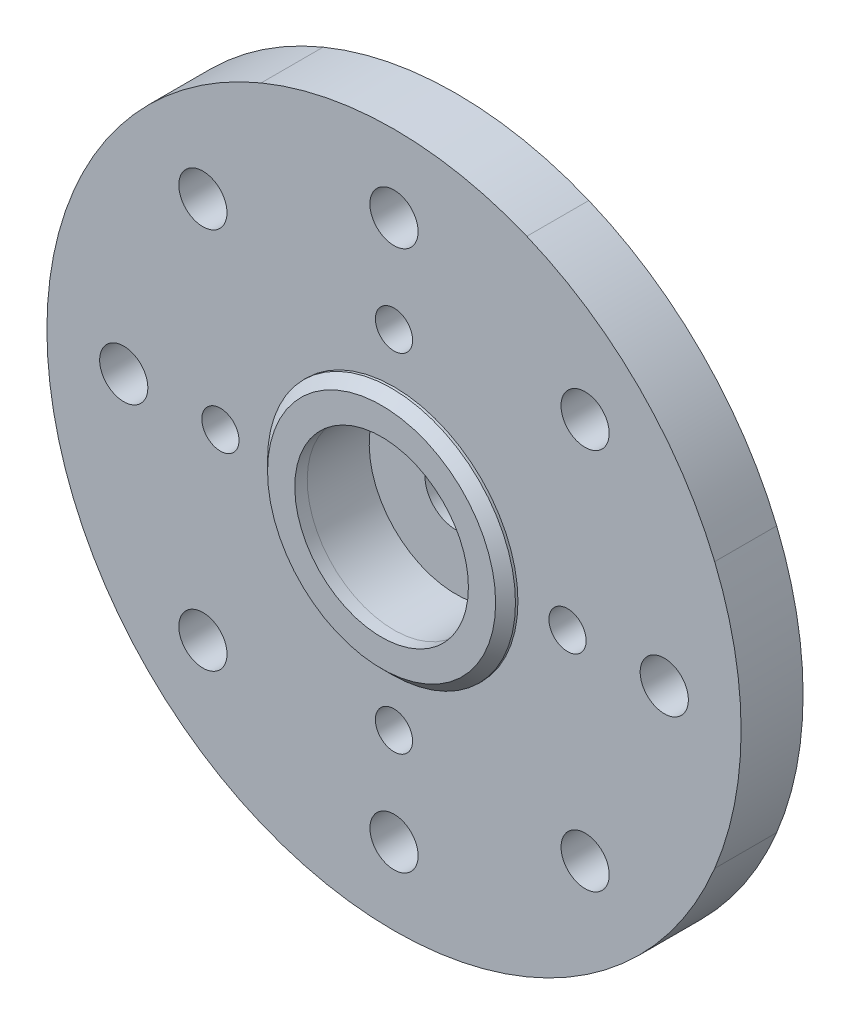
ISO-10303-21;
HEADER;
FILE_DESCRIPTION(('STEP AP214'),'2;1');
FILE_NAME('part.step','',(''),(''),'','','');
FILE_SCHEMA(('AUTOMOTIVE_DESIGN { 1 0 10303 214 1 1 1 1 }'));
ENDSEC;
DATA;
#1=APPLICATION_CONTEXT('core data for automotive mechanical design processes');
#2=APPLICATION_PROTOCOL_DEFINITION('international standard','automotive_design',2000,#1);
#3=PRODUCT_CONTEXT('',#1,'mechanical');
#4=PRODUCT('Part','Part','',(#3));
#5=PRODUCT_RELATED_PRODUCT_CATEGORY('part','',(#4));
#6=PRODUCT_DEFINITION_FORMATION('','',#4);
#7=PRODUCT_DEFINITION_CONTEXT('part definition',#1,'design');
#8=PRODUCT_DEFINITION('design','',#6,#7);
#9=PRODUCT_DEFINITION_SHAPE('','',#8);
#10=(LENGTH_UNIT() NAMED_UNIT(*) SI_UNIT(.MILLI.,.METRE.));
#11=(NAMED_UNIT(*) PLANE_ANGLE_UNIT() SI_UNIT($,.RADIAN.));
#12=(NAMED_UNIT(*) SI_UNIT($,.STERADIAN.) SOLID_ANGLE_UNIT());
#13=UNCERTAINTY_MEASURE_WITH_UNIT(LENGTH_MEASURE(1.E-05),#10,'distance_accuracy_value','');
#14=(GEOMETRIC_REPRESENTATION_CONTEXT(3) GLOBAL_UNCERTAINTY_ASSIGNED_CONTEXT((#13)) GLOBAL_UNIT_ASSIGNED_CONTEXT((#10,
#11,#12)) REPRESENTATION_CONTEXT('',''));
#15=CARTESIAN_POINT('',(0.,0.,0.));
#16=DIRECTION('',(0.,0.,1.));
#17=DIRECTION('',(1.,0.,0.));
#18=AXIS2_PLACEMENT_3D('',#15,#16,#17);
#19=CARTESIAN_POINT('',(0.,0.,0.));
#20=DIRECTION('',(0.,0.,1.));
#21=DIRECTION('',(1.,0.,0.));
#22=AXIS2_PLACEMENT_3D('',#19,#20,#21);
#23=PLANE('',#22);
#24=CARTESIAN_POINT('',(-10.899,-0.000999999999885828,0.));
#25=DIRECTION('',(0.,0.,1.));
#26=DIRECTION('',(1.,0.,0.));
#27=AXIS2_PLACEMENT_3D('',#24,#25,#26);
#28=CIRCLE('',#27,0.971780714285714);
#29=CARTESIAN_POINT('',(-9.92721928571429,-0.000999999999885828,0.));
#30=VERTEX_POINT('',#29);
#31=EDGE_CURVE('E197',#30,#30,#28,.T.);
#32=ORIENTED_EDGE('',*,*,#31,.T.);
#33=EDGE_LOOP('',(#32));
#34=FACE_BOUND('',#33,.T.);
#35=CARTESIAN_POINT('',(-7.70575680815225,-7.70817102171449,0.));
#36=DIRECTION('',(0.,0.,1.));
#37=DIRECTION('',(1.,0.,0.));
#38=AXIS2_PLACEMENT_3D('',#35,#36,#37);
#39=CIRCLE('',#38,0.971780714285715);
#40=CARTESIAN_POINT('',(-6.73397609386653,-7.70817102171449,0.));
#41=VERTEX_POINT('',#40);
#42=EDGE_CURVE('E194',#41,#41,#39,.T.);
#43=ORIENTED_EDGE('',*,*,#42,.T.);
#44=EDGE_LOOP('',(#43));
#45=FACE_BOUND('',#44,.T.);
#46=CARTESIAN_POINT('',(-7.70717102171446,7.70675680815227,0.));
#47=DIRECTION('',(0.,0.,1.));
#48=DIRECTION('',(1.,0.,0.));
#49=AXIS2_PLACEMENT_3D('',#46,#47,#48);
#50=CIRCLE('',#49,0.971780714285714);
#51=CARTESIAN_POINT('',(-6.73539030742875,7.70675680815227,0.));
#52=VERTEX_POINT('',#51);
#53=EDGE_CURVE('E191',#52,#52,#50,.T.);
#54=ORIENTED_EDGE('',*,*,#53,.T.);
#55=EDGE_LOOP('',(#54));
#56=FACE_BOUND('',#55,.T.);
#57=CARTESIAN_POINT('',(-6.99999999999981,-1.94734675410807E-13,0.));
#58=DIRECTION('',(0.,0.,1.));
#59=DIRECTION('',(1.,0.,0.));
#60=AXIS2_PLACEMENT_3D('',#57,#58,#59);
#61=CIRCLE('',#60,0.750000000000418);
#62=CARTESIAN_POINT('',(-6.24999999999939,-1.94734675410807E-13,0.));
#63=VERTEX_POINT('',#62);
#64=EDGE_CURVE('E188',#63,#63,#61,.T.);
#65=ORIENTED_EDGE('',*,*,#64,.T.);
#66=EDGE_LOOP('',(#65));
#67=FACE_BOUND('',#66,.T.);
#68=CARTESIAN_POINT('',(0.00099999999999999,-0.001,0.));
#69=DIRECTION('',(0.,0.,1.));
#70=DIRECTION('',(1.,0.,0.));
#71=AXIS2_PLACEMENT_3D('',#68,#69,#70);
#72=CIRCLE('',#71,14.);
#73=CARTESIAN_POINT('',(5.35821449768997,12.9334598969474,0.));
#74=VERTEX_POINT('',#73);
#75=CARTESIAN_POINT('',(-5.35621449771901,12.9334598969354,0.));
#76=VERTEX_POINT('',#75);
#77=EDGE_CURVE('E174',#74,#76,#72,.T.);
#78=ORIENTED_EDGE('',*,*,#77,.F.);
#79=CARTESIAN_POINT('',(0.000292893218813444,-0.000707106781186539,0.));
#80=DIRECTION('',(0.,0.,1.));
#81=DIRECTION('',(1.,0.,0.));
#82=AXIS2_PLACEMENT_3D('',#79,#80,#81);
#83=CIRCLE('',#82,14.);
#84=CARTESIAN_POINT('',(12.9344598969475,5.35721449768974,0.));
#85=VERTEX_POINT('',#84);
#86=EDGE_CURVE('E87',#85,#74,#83,.T.);
#87=ORIENTED_EDGE('',*,*,#86,.F.);
#88=CARTESIAN_POINT('',(0.,0.,0.));
#89=DIRECTION('',(0.,0.,1.));
#90=DIRECTION('',(1.,0.,0.));
#91=AXIS2_PLACEMENT_3D('',#88,#89,#90);
#92=CIRCLE('',#91,14.);
#93=CARTESIAN_POINT('',(12.9344598969353,-5.35721449771915,0.));
#94=VERTEX_POINT('',#93);
#95=EDGE_CURVE('E81',#94,#85,#92,.T.);
#96=ORIENTED_EDGE('',*,*,#95,.F.);
#97=CARTESIAN_POINT('',(0.000292893218813454,0.000707106781186549,0.));
#98=DIRECTION('',(0.,0.,1.));
#99=DIRECTION('',(1.,0.,0.));
#100=AXIS2_PLACEMENT_3D('',#97,#98,#99);
#101=CIRCLE('',#100,14.);
#102=CARTESIAN_POINT('',(5.35821449771911,-12.9334598969353,0.));
#103=VERTEX_POINT('',#102);
#104=EDGE_CURVE('E124',#103,#94,#101,.T.);
#105=ORIENTED_EDGE('',*,*,#104,.F.);
#106=CARTESIAN_POINT('',(0.001,0.001,0.));
#107=DIRECTION('',(0.,0.,1.));
#108=DIRECTION('',(1.,0.,0.));
#109=AXIS2_PLACEMENT_3D('',#106,#107,#108);
#110=CIRCLE('',#109,14.);
#111=CARTESIAN_POINT('',(-5.3562144977192,-12.9334598969353,0.));
#112=VERTEX_POINT('',#111);
#113=EDGE_CURVE('E183',#112,#103,#110,.T.);
#114=ORIENTED_EDGE('',*,*,#113,.F.);
#115=CARTESIAN_POINT('',(0.00170710678118655,0.000707106781186544,0.));
#116=DIRECTION('',(0.,0.,1.));
#117=DIRECTION('',(1.,0.,0.));
#118=AXIS2_PLACEMENT_3D('',#115,#116,#117);
#119=CIRCLE('',#118,14.);
#120=CARTESIAN_POINT('',(-12.9324598969353,-5.35721449771906,0.));
#121=VERTEX_POINT('',#120);
#122=EDGE_CURVE('E181',#121,#112,#119,.T.);
#123=ORIENTED_EDGE('',*,*,#122,.F.);
#124=CARTESIAN_POINT('',(0.002,0.,0.));
#125=DIRECTION('',(0.,0.,1.));
#126=DIRECTION('',(1.,0.,0.));
#127=AXIS2_PLACEMENT_3D('',#124,#125,#126);
#128=CIRCLE('',#127,14.);
#129=CARTESIAN_POINT('',(-12.9324598969353,5.35721449771924,0.));
#130=VERTEX_POINT('',#129);
#131=EDGE_CURVE('E179',#130,#121,#128,.T.);
#132=ORIENTED_EDGE('',*,*,#131,.F.);
#133=CARTESIAN_POINT('',(0.00170710678118654,-0.000707106781186554,0.));
#134=DIRECTION('',(0.,0.,1.));
#135=DIRECTION('',(1.,0.,0.));
#136=AXIS2_PLACEMENT_3D('',#133,#134,#135);
#137=CIRCLE('',#136,14.);
#138=EDGE_CURVE('E177',#76,#130,#137,.T.);
#139=ORIENTED_EDGE('',*,*,#138,.F.);
#140=EDGE_LOOP('',(#78,#87,#96,#105,#114,#123,#132,#139));
#141=FACE_BOUND('',#140,.T.);
#142=CARTESIAN_POINT('',(7.00000000000019,1.93877422651404E-13,0.));
#143=DIRECTION('',(0.,0.,1.));
#144=DIRECTION('',(1.,0.,0.));
#145=AXIS2_PLACEMENT_3D('',#142,#143,#144);
#146=CIRCLE('',#145,0.750000000000418);
#147=CARTESIAN_POINT('',(7.75000000000061,1.93877422651404E-13,0.));
#148=VERTEX_POINT('',#147);
#149=EDGE_CURVE('E171',#148,#148,#146,.T.);
#150=ORIENTED_EDGE('',*,*,#149,.T.);
#151=EDGE_LOOP('',(#150));
#152=FACE_BOUND('',#151,.T.);
#153=CARTESIAN_POINT('',(7.70917102171451,-7.70675680815222,0.));
#154=DIRECTION('',(0.,0.,1.));
#155=DIRECTION('',(1.,0.,0.));
#156=AXIS2_PLACEMENT_3D('',#153,#154,#155);
#157=CIRCLE('',#156,0.971780714285714);
#158=CARTESIAN_POINT('',(8.68095173600023,-7.70675680815222,0.));
#159=VERTEX_POINT('',#158);
#160=EDGE_CURVE('E168',#159,#159,#157,.T.);
#161=ORIENTED_EDGE('',*,*,#160,.T.);
#162=EDGE_LOOP('',(#161));
#163=FACE_BOUND('',#162,.T.);
#164=CARTESIAN_POINT('',(7.70775680815219,7.70817102171454,0.));
#165=DIRECTION('',(0.,0.,1.));
#166=DIRECTION('',(1.,0.,0.));
#167=AXIS2_PLACEMENT_3D('',#164,#165,#166);
#168=CIRCLE('',#167,0.971780714285715);
#169=CARTESIAN_POINT('',(8.67953752243791,7.70817102171454,0.));
#170=VERTEX_POINT('',#169);
#171=EDGE_CURVE('E165',#170,#170,#168,.T.);
#172=ORIENTED_EDGE('',*,*,#171,.T.);
#173=EDGE_LOOP('',(#172));
#174=FACE_BOUND('',#173,.T.);
#175=CARTESIAN_POINT('',(10.901,0.000999999999961943,0.));
#176=DIRECTION('',(0.,0.,1.));
#177=DIRECTION('',(1.,0.,0.));
#178=AXIS2_PLACEMENT_3D('',#175,#176,#177);
#179=CIRCLE('',#178,0.971780714285715);
#180=CARTESIAN_POINT('',(11.8727807142857,0.000999999999961943,0.));
#181=VERTEX_POINT('',#180);
#182=EDGE_CURVE('E162',#181,#181,#179,.T.);
#183=ORIENTED_EDGE('',*,*,#182,.T.);
#184=EDGE_LOOP('',(#183));
#185=FACE_BOUND('',#184,.T.);
#186=CARTESIAN_POINT('',(0.00199999999992389,-10.9,0.));
#187=DIRECTION('',(0.,0.,1.));
#188=DIRECTION('',(1.,0.,0.));
#189=AXIS2_PLACEMENT_3D('',#186,#187,#188);
#190=CIRCLE('',#189,0.971780714285714);
#191=CARTESIAN_POINT('',(0.973780714285638,-10.9,0.));
#192=VERTEX_POINT('',#191);
#193=EDGE_CURVE('E159',#192,#192,#190,.T.);
#194=ORIENTED_EDGE('',*,*,#193,.T.);
#195=EDGE_LOOP('',(#194));
#196=FACE_BOUND('',#195,.T.);
#197=CARTESIAN_POINT('',(3.88612098062211E-13,-7.,0.));
#198=DIRECTION('',(0.,0.,1.));
#199=DIRECTION('',(1.,0.,0.));
#200=AXIS2_PLACEMENT_3D('',#197,#198,#199);
#201=CIRCLE('',#200,0.750000000000418);
#202=CARTESIAN_POINT('',(0.750000000000807,-7.,0.));
#203=VERTEX_POINT('',#202);
#204=EDGE_CURVE('E156',#203,#203,#201,.T.);
#205=ORIENTED_EDGE('',*,*,#204,.T.);
#206=EDGE_LOOP('',(#205));
#207=FACE_BOUND('',#206,.T.);
#208=CARTESIAN_POINT('',(0.,7.,0.));
#209=DIRECTION('',(0.,0.,1.));
#210=DIRECTION('',(1.,0.,0.));
#211=AXIS2_PLACEMENT_3D('',#208,#209,#210);
#212=CIRCLE('',#211,0.750000000000418);
#213=CARTESIAN_POINT('',(0.750000000000419,7.,0.));
#214=VERTEX_POINT('',#213);
#215=EDGE_CURVE('E149',#214,#214,#212,.T.);
#216=ORIENTED_EDGE('',*,*,#215,.T.);
#217=EDGE_LOOP('',(#216));
#218=FACE_BOUND('',#217,.T.);
#219=CARTESIAN_POINT('',(0.,10.9,0.));
#220=DIRECTION('',(0.,0.,1.));
#221=DIRECTION('',(1.,0.,0.));
#222=AXIS2_PLACEMENT_3D('',#219,#220,#221);
#223=CIRCLE('',#222,0.971780714285715);
#224=CARTESIAN_POINT('',(0.971780714285715,10.9,0.));
#225=VERTEX_POINT('',#224);
#226=EDGE_CURVE('E146',#225,#225,#223,.T.);
#227=ORIENTED_EDGE('',*,*,#226,.T.);
#228=EDGE_LOOP('',(#227));
#229=FACE_BOUND('',#228,.T.);
#230=CARTESIAN_POINT('',(0.,0.,0.));
#231=DIRECTION('',(0.,0.,1.));
#232=DIRECTION('',(1.,0.,0.));
#233=AXIS2_PLACEMENT_3D('',#230,#231,#232);
#234=CIRCLE('',#233,5.);
#235=CARTESIAN_POINT('',(5.,0.,0.));
#236=VERTEX_POINT('',#235);
#237=EDGE_CURVE('E215',#236,#236,#234,.F.);
#238=ORIENTED_EDGE('',*,*,#237,.F.);
#239=EDGE_LOOP('',(#238));
#240=FACE_BOUND('',#239,.T.);
#241=ADVANCED_FACE('F35',(#34,#45,#56,#67,#141,#152,#163,#174,#185,#196,#207,#218,#229,#240),
#23,.F.);
#242=CARTESIAN_POINT('',(0.00099999999999999,-0.001,2.5));
#243=DIRECTION('',(0.,0.,-1.));
#244=DIRECTION('',(-1.,0.,0.));
#245=AXIS2_PLACEMENT_3D('',#242,#243,#244);
#246=CYLINDRICAL_SURFACE('',#245,14.);
#247=ORIENTED_EDGE('',*,*,#77,.T.);
#248=DIRECTION('',(0.,0.,-1.));
#249=VECTOR('',#248,1.);
#250=CARTESIAN_POINT('',(-5.35621449771901,12.9334598969354,2.5));
#251=LINE('',#250,#249);
#252=CARTESIAN_POINT('',(-5.35621449771901,12.9334598969354,2.5));
#253=VERTEX_POINT('',#252);
#254=EDGE_CURVE('E213',#253,#76,#251,.T.);
#255=ORIENTED_EDGE('',*,*,#254,.F.);
#256=CARTESIAN_POINT('',(0.00099999999999999,-0.001,2.5));
#257=DIRECTION('',(0.,0.,1.));
#258=DIRECTION('',(1.,0.,0.));
#259=AXIS2_PLACEMENT_3D('',#256,#257,#258);
#260=CIRCLE('',#259,14.);
#261=CARTESIAN_POINT('',(5.35821449768997,12.9334598969474,2.5));
#262=VERTEX_POINT('',#261);
#263=EDGE_CURVE('E408',#262,#253,#260,.T.);
#264=ORIENTED_EDGE('',*,*,#263,.F.);
#265=DIRECTION('',(0.,0.,-1.));
#266=VECTOR('',#265,1.);
#267=CARTESIAN_POINT('',(5.35821449768997,12.9334598969474,2.5));
#268=LINE('',#267,#266);
#269=EDGE_CURVE('E145',#262,#74,#268,.T.);
#270=ORIENTED_EDGE('',*,*,#269,.T.);
#271=EDGE_LOOP('',(#247,#255,#264,#270));
#272=FACE_BOUND('',#271,.T.);
#273=ADVANCED_FACE('F254',(#272),#246,.T.);
#274=CARTESIAN_POINT('',(0.00170710678118654,-0.000707106781186554,2.5));
#275=DIRECTION('',(0.,0.,-1.));
#276=DIRECTION('',(-1.,0.,0.));
#277=AXIS2_PLACEMENT_3D('',#274,#275,#276);
#278=CYLINDRICAL_SURFACE('',#277,14.);
#279=ORIENTED_EDGE('',*,*,#138,.T.);
#280=DIRECTION('',(0.,0.,-1.));
#281=VECTOR('',#280,1.);
#282=CARTESIAN_POINT('',(-12.9324598969353,5.35721449771924,2.5));
#283=LINE('',#282,#281);
#284=CARTESIAN_POINT('',(-12.9324598969353,5.35721449771924,2.5));
#285=VERTEX_POINT('',#284);
#286=EDGE_CURVE('E210',#285,#130,#283,.T.);
#287=ORIENTED_EDGE('',*,*,#286,.F.);
#288=CARTESIAN_POINT('',(0.00170710678118654,-0.000707106781186554,2.5));
#289=DIRECTION('',(0.,0.,1.));
#290=DIRECTION('',(1.,0.,0.));
#291=AXIS2_PLACEMENT_3D('',#288,#289,#290);
#292=CIRCLE('',#291,14.);
#293=EDGE_CURVE('E96',#253,#285,#292,.T.);
#294=ORIENTED_EDGE('',*,*,#293,.F.);
#295=ORIENTED_EDGE('',*,*,#254,.T.);
#296=EDGE_LOOP('',(#279,#287,#294,#295));
#297=FACE_BOUND('',#296,.T.);
#298=ADVANCED_FACE('F260',(#297),#278,.T.);
#299=CARTESIAN_POINT('',(0.002,0.,2.5));
#300=DIRECTION('',(0.,0.,-1.));
#301=DIRECTION('',(-1.,0.,0.));
#302=AXIS2_PLACEMENT_3D('',#299,#300,#301);
#303=CYLINDRICAL_SURFACE('',#302,14.);
#304=ORIENTED_EDGE('',*,*,#131,.T.);
#305=DIRECTION('',(0.,0.,-1.));
#306=VECTOR('',#305,1.);
#307=CARTESIAN_POINT('',(-12.9324598969353,-5.35721449771906,2.5));
#308=LINE('',#307,#306);
#309=CARTESIAN_POINT('',(-12.9324598969353,-5.35721449771906,2.5));
#310=VERTEX_POINT('',#309);
#311=EDGE_CURVE('E207',#310,#121,#308,.T.);
#312=ORIENTED_EDGE('',*,*,#311,.F.);
#313=CARTESIAN_POINT('',(0.002,0.,2.5));
#314=DIRECTION('',(0.,0.,1.));
#315=DIRECTION('',(1.,0.,0.));
#316=AXIS2_PLACEMENT_3D('',#313,#314,#315);
#317=CIRCLE('',#316,14.);
#318=EDGE_CURVE('E411',#285,#310,#317,.T.);
#319=ORIENTED_EDGE('',*,*,#318,.F.);
#320=ORIENTED_EDGE('',*,*,#286,.T.);
#321=EDGE_LOOP('',(#304,#312,#319,#320));
#322=FACE_BOUND('',#321,.T.);
#323=ADVANCED_FACE('F294',(#322),#303,.T.);
#324=CARTESIAN_POINT('',(0.00170710678118655,0.000707106781186544,2.5));
#325=DIRECTION('',(0.,0.,-1.));
#326=DIRECTION('',(-1.,0.,0.));
#327=AXIS2_PLACEMENT_3D('',#324,#325,#326);
#328=CYLINDRICAL_SURFACE('',#327,14.);
#329=ORIENTED_EDGE('',*,*,#122,.T.);
#330=DIRECTION('',(0.,0.,-1.));
#331=VECTOR('',#330,1.);
#332=CARTESIAN_POINT('',(-5.3562144977192,-12.9334598969353,2.5));
#333=LINE('',#332,#331);
#334=CARTESIAN_POINT('',(-5.3562144977192,-12.9334598969353,2.5));
#335=VERTEX_POINT('',#334);
#336=EDGE_CURVE('E204',#335,#112,#333,.T.);
#337=ORIENTED_EDGE('',*,*,#336,.F.);
#338=CARTESIAN_POINT('',(0.00170710678118655,0.000707106781186544,2.5));
#339=DIRECTION('',(0.,0.,1.));
#340=DIRECTION('',(1.,0.,0.));
#341=AXIS2_PLACEMENT_3D('',#338,#339,#340);
#342=CIRCLE('',#341,14.);
#343=EDGE_CURVE('E413',#310,#335,#342,.T.);
#344=ORIENTED_EDGE('',*,*,#343,.F.);
#345=ORIENTED_EDGE('',*,*,#311,.T.);
#346=EDGE_LOOP('',(#329,#337,#344,#345));
#347=FACE_BOUND('',#346,.T.);
#348=ADVANCED_FACE('F290',(#347),#328,.T.);
#349=CARTESIAN_POINT('',(0.001,0.001,2.5));
#350=DIRECTION('',(0.,0.,-1.));
#351=DIRECTION('',(-1.,0.,0.));
#352=AXIS2_PLACEMENT_3D('',#349,#350,#351);
#353=CYLINDRICAL_SURFACE('',#352,14.);
#354=ORIENTED_EDGE('',*,*,#113,.T.);
#355=DIRECTION('',(0.,0.,-1.));
#356=VECTOR('',#355,1.);
#357=CARTESIAN_POINT('',(5.35821449771911,-12.9334598969353,2.5));
#358=LINE('',#357,#356);
#359=CARTESIAN_POINT('',(5.35821449771911,-12.9334598969353,2.5));
#360=VERTEX_POINT('',#359);
#361=EDGE_CURVE('E125',#360,#103,#358,.T.);
#362=ORIENTED_EDGE('',*,*,#361,.F.);
#363=CARTESIAN_POINT('',(0.001,0.001,2.5));
#364=DIRECTION('',(0.,0.,1.));
#365=DIRECTION('',(1.,0.,0.));
#366=AXIS2_PLACEMENT_3D('',#363,#364,#365);
#367=CIRCLE('',#366,14.);
#368=EDGE_CURVE('E116',#335,#360,#367,.T.);
#369=ORIENTED_EDGE('',*,*,#368,.F.);
#370=ORIENTED_EDGE('',*,*,#336,.T.);
#371=EDGE_LOOP('',(#354,#362,#369,#370));
#372=FACE_BOUND('',#371,.T.);
#373=ADVANCED_FACE('F287',(#372),#353,.T.);
#374=CARTESIAN_POINT('',(0.000292893218813454,0.000707106781186549,2.5));
#375=DIRECTION('',(0.,0.,-1.));
#376=DIRECTION('',(-1.,0.,0.));
#377=AXIS2_PLACEMENT_3D('',#374,#375,#376);
#378=CYLINDRICAL_SURFACE('',#377,14.);
#379=ORIENTED_EDGE('',*,*,#104,.T.);
#380=DIRECTION('',(0.,0.,-1.));
#381=VECTOR('',#380,1.);
#382=CARTESIAN_POINT('',(12.9344598969353,-5.35721449771915,2.5));
#383=LINE('',#382,#381);
#384=CARTESIAN_POINT('',(12.9344598969353,-5.35721449771915,2.5));
#385=VERTEX_POINT('',#384);
#386=EDGE_CURVE('E121',#385,#94,#383,.T.);
#387=ORIENTED_EDGE('',*,*,#386,.F.);
#388=CARTESIAN_POINT('',(0.000292893218813454,0.000707106781186549,2.5));
#389=DIRECTION('',(0.,0.,1.));
#390=DIRECTION('',(1.,0.,0.));
#391=AXIS2_PLACEMENT_3D('',#388,#389,#390);
#392=CIRCLE('',#391,14.);
#393=EDGE_CURVE('E109',#360,#385,#392,.T.);
#394=ORIENTED_EDGE('',*,*,#393,.F.);
#395=ORIENTED_EDGE('',*,*,#361,.T.);
#396=EDGE_LOOP('',(#379,#387,#394,#395));
#397=FACE_BOUND('',#396,.T.);
#398=ADVANCED_FACE('F122',(#397),#378,.T.);
#399=CARTESIAN_POINT('',(0.,0.,2.5));
#400=DIRECTION('',(0.,0.,-1.));
#401=DIRECTION('',(-1.,0.,0.));
#402=AXIS2_PLACEMENT_3D('',#399,#400,#401);
#403=CYLINDRICAL_SURFACE('',#402,14.);
#404=ORIENTED_EDGE('',*,*,#95,.T.);
#405=DIRECTION('',(0.,0.,-1.));
#406=VECTOR('',#405,1.);
#407=CARTESIAN_POINT('',(12.9344598969475,5.35721449768974,2.5));
#408=LINE('',#407,#406);
#409=CARTESIAN_POINT('',(12.9344598969475,5.35721449768974,2.5));
#410=VERTEX_POINT('',#409);
#411=EDGE_CURVE('E126',#410,#85,#408,.T.);
#412=ORIENTED_EDGE('',*,*,#411,.F.);
#413=CARTESIAN_POINT('',(0.,0.,2.5));
#414=DIRECTION('',(0.,0.,1.));
#415=DIRECTION('',(1.,0.,0.));
#416=AXIS2_PLACEMENT_3D('',#413,#414,#415);
#417=CIRCLE('',#416,14.);
#418=EDGE_CURVE('E114',#385,#410,#417,.T.);
#419=ORIENTED_EDGE('',*,*,#418,.F.);
#420=ORIENTED_EDGE('',*,*,#386,.T.);
#421=EDGE_LOOP('',(#404,#412,#419,#420));
#422=FACE_BOUND('',#421,.T.);
#423=ADVANCED_FACE('F128',(#422),#403,.T.);
#424=CARTESIAN_POINT('',(-7.70575680815225,-7.70817102171449,2.5));
#425=DIRECTION('',(0.,0.,-1.));
#426=DIRECTION('',(-1.,0.,0.));
#427=AXIS2_PLACEMENT_3D('',#424,#425,#426);
#428=CYLINDRICAL_SURFACE('',#427,0.971780714285715);
#429=CARTESIAN_POINT('',(-7.70575680815225,-7.70817102171449,2.5));
#430=DIRECTION('',(0.,0.,1.));
#431=DIRECTION('',(1.,0.,0.));
#432=AXIS2_PLACEMENT_3D('',#429,#430,#431);
#433=CIRCLE('',#432,0.971780714285715);
#434=CARTESIAN_POINT('',(-6.73397609386653,-7.70817102171449,2.5));
#435=VERTEX_POINT('',#434);
#436=EDGE_CURVE('E139',#435,#435,#433,.T.);
#437=ORIENTED_EDGE('',*,*,#436,.T.);
#438=EDGE_LOOP('',(#437));
#439=FACE_BOUND('',#438,.T.);
#440=ORIENTED_EDGE('',*,*,#42,.F.);
#441=EDGE_LOOP('',(#440));
#442=FACE_BOUND('',#441,.T.);
#443=ADVANCED_FACE('F267',(#439,#442),#428,.F.);
#444=CARTESIAN_POINT('',(-7.70717102171446,7.70675680815227,2.5));
#445=DIRECTION('',(0.,0.,-1.));
#446=DIRECTION('',(-1.,0.,0.));
#447=AXIS2_PLACEMENT_3D('',#444,#445,#446);
#448=CYLINDRICAL_SURFACE('',#447,0.971780714285714);
#449=CARTESIAN_POINT('',(-7.70717102171446,7.70675680815227,2.5));
#450=DIRECTION('',(0.,0.,1.));
#451=DIRECTION('',(1.,0.,0.));
#452=AXIS2_PLACEMENT_3D('',#449,#450,#451);
#453=CIRCLE('',#452,0.971780714285714);
#454=CARTESIAN_POINT('',(-6.73539030742875,7.70675680815227,2.5));
#455=VERTEX_POINT('',#454);
#456=EDGE_CURVE('E136',#455,#455,#453,.T.);
#457=ORIENTED_EDGE('',*,*,#456,.T.);
#458=EDGE_LOOP('',(#457));
#459=FACE_BOUND('',#458,.T.);
#460=ORIENTED_EDGE('',*,*,#53,.F.);
#461=EDGE_LOOP('',(#460));
#462=FACE_BOUND('',#461,.T.);
#463=ADVANCED_FACE('F270',(#459,#462),#448,.F.);
#464=CARTESIAN_POINT('',(-6.99999999999981,-1.94734675410807E-13,2.5));
#465=DIRECTION('',(0.,0.,-1.));
#466=DIRECTION('',(-1.,0.,0.));
#467=AXIS2_PLACEMENT_3D('',#464,#465,#466);
#468=CYLINDRICAL_SURFACE('',#467,0.750000000000418);
#469=CARTESIAN_POINT('',(-6.99999999999981,-1.94734675410807E-13,2.5));
#470=DIRECTION('',(0.,0.,1.));
#471=DIRECTION('',(1.,0.,0.));
#472=AXIS2_PLACEMENT_3D('',#469,#470,#471);
#473=CIRCLE('',#472,0.750000000000418);
#474=CARTESIAN_POINT('',(-6.24999999999939,-1.94734675410807E-13,2.5));
#475=VERTEX_POINT('',#474);
#476=EDGE_CURVE('E130',#475,#475,#473,.T.);
#477=ORIENTED_EDGE('',*,*,#476,.T.);
#478=EDGE_LOOP('',(#477));
#479=FACE_BOUND('',#478,.T.);
#480=ORIENTED_EDGE('',*,*,#64,.F.);
#481=EDGE_LOOP('',(#480));
#482=FACE_BOUND('',#481,.T.);
#483=ADVANCED_FACE('F274',(#479,#482),#468,.F.);
#484=CARTESIAN_POINT('',(0.000292893218813444,-0.000707106781186539,2.5));
#485=DIRECTION('',(0.,0.,-1.));
#486=DIRECTION('',(-1.,0.,0.));
#487=AXIS2_PLACEMENT_3D('',#484,#485,#486);
#488=CYLINDRICAL_SURFACE('',#487,14.);
#489=ORIENTED_EDGE('',*,*,#86,.T.);
#490=ORIENTED_EDGE('',*,*,#269,.F.);
#491=CARTESIAN_POINT('',(0.000292893218813444,-0.000707106781186539,2.5));
#492=DIRECTION('',(0.,0.,1.));
#493=DIRECTION('',(1.,0.,0.));
#494=AXIS2_PLACEMENT_3D('',#491,#492,#493);
#495=CIRCLE('',#494,14.);
#496=EDGE_CURVE('E52',#410,#262,#495,.T.);
#497=ORIENTED_EDGE('',*,*,#496,.F.);
#498=ORIENTED_EDGE('',*,*,#411,.T.);
#499=EDGE_LOOP('',(#489,#490,#497,#498));
#500=FACE_BOUND('',#499,.T.);
#501=ADVANCED_FACE('F278',(#500),#488,.T.);
#502=CARTESIAN_POINT('',(7.00000000000019,1.93877422651404E-13,2.5));
#503=DIRECTION('',(0.,0.,-1.));
#504=DIRECTION('',(-1.,0.,0.));
#505=AXIS2_PLACEMENT_3D('',#502,#503,#504);
#506=CYLINDRICAL_SURFACE('',#505,0.750000000000418);
#507=CARTESIAN_POINT('',(7.00000000000019,1.93877422651404E-13,2.5));
#508=DIRECTION('',(0.,0.,1.));
#509=DIRECTION('',(1.,0.,0.));
#510=AXIS2_PLACEMENT_3D('',#507,#508,#509);
#511=CIRCLE('',#510,0.750000000000418);
#512=CARTESIAN_POINT('',(7.75000000000061,1.93877422651404E-13,2.5));
#513=VERTEX_POINT('',#512);
#514=EDGE_CURVE('E405',#513,#513,#511,.T.);
#515=ORIENTED_EDGE('',*,*,#514,.T.);
#516=EDGE_LOOP('',(#515));
#517=FACE_BOUND('',#516,.T.);
#518=ORIENTED_EDGE('',*,*,#149,.F.);
#519=EDGE_LOOP('',(#518));
#520=FACE_BOUND('',#519,.T.);
#521=ADVANCED_FACE('F282',(#517,#520),#506,.F.);
#522=CARTESIAN_POINT('',(7.70917102171451,-7.70675680815222,2.5));
#523=DIRECTION('',(0.,0.,-1.));
#524=DIRECTION('',(-1.,0.,0.));
#525=AXIS2_PLACEMENT_3D('',#522,#523,#524);
#526=CYLINDRICAL_SURFACE('',#525,0.971780714285714);
#527=CARTESIAN_POINT('',(7.70917102171451,-7.70675680815222,2.5));
#528=DIRECTION('',(0.,0.,1.));
#529=DIRECTION('',(1.,0.,0.));
#530=AXIS2_PLACEMENT_3D('',#527,#528,#529);
#531=CIRCLE('',#530,0.971780714285714);
#532=CARTESIAN_POINT('',(8.68095173600023,-7.70675680815222,2.5));
#533=VERTEX_POINT('',#532);
#534=EDGE_CURVE('E402',#533,#533,#531,.T.);
#535=ORIENTED_EDGE('',*,*,#534,.T.);
#536=EDGE_LOOP('',(#535));
#537=FACE_BOUND('',#536,.T.);
#538=ORIENTED_EDGE('',*,*,#160,.F.);
#539=EDGE_LOOP('',(#538));
#540=FACE_BOUND('',#539,.T.);
#541=ADVANCED_FACE('F303',(#537,#540),#526,.F.);
#542=CARTESIAN_POINT('',(7.70775680815219,7.70817102171454,2.5));
#543=DIRECTION('',(0.,0.,-1.));
#544=DIRECTION('',(-1.,0.,0.));
#545=AXIS2_PLACEMENT_3D('',#542,#543,#544);
#546=CYLINDRICAL_SURFACE('',#545,0.971780714285715);
#547=CARTESIAN_POINT('',(7.70775680815219,7.70817102171454,2.5));
#548=DIRECTION('',(0.,0.,1.));
#549=DIRECTION('',(1.,0.,0.));
#550=AXIS2_PLACEMENT_3D('',#547,#548,#549);
#551=CIRCLE('',#550,0.971780714285715);
#552=CARTESIAN_POINT('',(8.67953752243791,7.70817102171454,2.5));
#553=VERTEX_POINT('',#552);
#554=EDGE_CURVE('E399',#553,#553,#551,.T.);
#555=ORIENTED_EDGE('',*,*,#554,.T.);
#556=EDGE_LOOP('',(#555));
#557=FACE_BOUND('',#556,.T.);
#558=ORIENTED_EDGE('',*,*,#171,.F.);
#559=EDGE_LOOP('',(#558));
#560=FACE_BOUND('',#559,.T.);
#561=ADVANCED_FACE('F307',(#557,#560),#546,.F.);
#562=CARTESIAN_POINT('',(10.901,0.000999999999961943,2.5));
#563=DIRECTION('',(0.,0.,-1.));
#564=DIRECTION('',(-1.,0.,0.));
#565=AXIS2_PLACEMENT_3D('',#562,#563,#564);
#566=CYLINDRICAL_SURFACE('',#565,0.971780714285715);
#567=CARTESIAN_POINT('',(10.901,0.000999999999961943,2.5));
#568=DIRECTION('',(0.,0.,1.));
#569=DIRECTION('',(1.,0.,0.));
#570=AXIS2_PLACEMENT_3D('',#567,#568,#569);
#571=CIRCLE('',#570,0.971780714285715);
#572=CARTESIAN_POINT('',(11.8727807142857,0.000999999999961943,2.5));
#573=VERTEX_POINT('',#572);
#574=EDGE_CURVE('E396',#573,#573,#571,.T.);
#575=ORIENTED_EDGE('',*,*,#574,.T.);
#576=EDGE_LOOP('',(#575));
#577=FACE_BOUND('',#576,.T.);
#578=ORIENTED_EDGE('',*,*,#182,.F.);
#579=EDGE_LOOP('',(#578));
#580=FACE_BOUND('',#579,.T.);
#581=ADVANCED_FACE('F311',(#577,#580),#566,.F.);
#582=CARTESIAN_POINT('',(0.00199999999992389,-10.9,2.5));
#583=DIRECTION('',(0.,0.,-1.));
#584=DIRECTION('',(-1.,0.,0.));
#585=AXIS2_PLACEMENT_3D('',#582,#583,#584);
#586=CYLINDRICAL_SURFACE('',#585,0.971780714285714);
#587=CARTESIAN_POINT('',(0.00199999999992389,-10.9,2.5));
#588=DIRECTION('',(0.,0.,1.));
#589=DIRECTION('',(1.,0.,0.));
#590=AXIS2_PLACEMENT_3D('',#587,#588,#589);
#591=CIRCLE('',#590,0.971780714285714);
#592=CARTESIAN_POINT('',(0.973780714285638,-10.9,2.5));
#593=VERTEX_POINT('',#592);
#594=EDGE_CURVE('E325',#593,#593,#591,.T.);
#595=ORIENTED_EDGE('',*,*,#594,.T.);
#596=EDGE_LOOP('',(#595));
#597=FACE_BOUND('',#596,.T.);
#598=ORIENTED_EDGE('',*,*,#193,.F.);
#599=EDGE_LOOP('',(#598));
#600=FACE_BOUND('',#599,.T.);
#601=ADVANCED_FACE('F314',(#597,#600),#586,.F.);
#602=CARTESIAN_POINT('',(3.88612098062211E-13,-7.,2.5));
#603=DIRECTION('',(0.,0.,-1.));
#604=DIRECTION('',(-1.,0.,0.));
#605=AXIS2_PLACEMENT_3D('',#602,#603,#604);
#606=CYLINDRICAL_SURFACE('',#605,0.750000000000418);
#607=CARTESIAN_POINT('',(3.88612098062211E-13,-7.,2.5));
#608=DIRECTION('',(0.,0.,1.));
#609=DIRECTION('',(1.,0.,0.));
#610=AXIS2_PLACEMENT_3D('',#607,#608,#609);
#611=CIRCLE('',#610,0.750000000000418);
#612=CARTESIAN_POINT('',(0.750000000000807,-7.,2.5));
#613=VERTEX_POINT('',#612);
#614=EDGE_CURVE('E392',#613,#613,#611,.T.);
#615=ORIENTED_EDGE('',*,*,#614,.T.);
#616=EDGE_LOOP('',(#615));
#617=FACE_BOUND('',#616,.T.);
#618=ORIENTED_EDGE('',*,*,#204,.F.);
#619=EDGE_LOOP('',(#618));
#620=FACE_BOUND('',#619,.T.);
#621=ADVANCED_FACE('F238',(#617,#620),#606,.F.);
#622=CARTESIAN_POINT('',(0.001,0.001,2.5));
#623=DIRECTION('',(0.,0.,-1.));
#624=DIRECTION('',(-1.,0.,0.));
#625=AXIS2_PLACEMENT_3D('',#622,#623,#624);
#626=CYLINDRICAL_SURFACE('',#625,3.5);
#627=CARTESIAN_POINT('',(0.001,0.001,2.5));
#628=DIRECTION('',(0.,0.,1.));
#629=DIRECTION('',(0.707106781186549,0.707106781186546,0.));
#630=AXIS2_PLACEMENT_3D('',#627,#628,#629);
#631=CIRCLE('',#630,3.5);
#632=CARTESIAN_POINT('',(2.47587373415292,2.47587373415291,2.5));
#633=VERTEX_POINT('',#632);
#634=EDGE_CURVE('E223',#633,#633,#631,.T.);
#635=ORIENTED_EDGE('',*,*,#634,.T.);
#636=EDGE_LOOP('',(#635));
#637=FACE_BOUND('',#636,.T.);
#638=CARTESIAN_POINT('',(0.001,0.001,0.));
#639=DIRECTION('',(0.,0.,1.));
#640=DIRECTION('',(1.,0.,0.));
#641=AXIS2_PLACEMENT_3D('',#638,#639,#640);
#642=CIRCLE('',#641,3.5);
#643=CARTESIAN_POINT('',(3.501,0.001,0.));
#644=VERTEX_POINT('',#643);
#645=EDGE_CURVE('E153',#644,#644,#642,.T.);
#646=ORIENTED_EDGE('',*,*,#645,.F.);
#647=EDGE_LOOP('',(#646));
#648=FACE_BOUND('',#647,.T.);
#649=ADVANCED_FACE('F227',(#637,#648),#626,.F.);
#650=CARTESIAN_POINT('',(0.,7.,2.5));
#651=DIRECTION('',(0.,0.,-1.));
#652=DIRECTION('',(-1.,0.,0.));
#653=AXIS2_PLACEMENT_3D('',#650,#651,#652);
#654=CYLINDRICAL_SURFACE('',#653,0.750000000000418);
#655=CARTESIAN_POINT('',(0.,7.,2.5));
#656=DIRECTION('',(0.,0.,1.));
#657=DIRECTION('',(1.,0.,0.));
#658=AXIS2_PLACEMENT_3D('',#655,#656,#657);
#659=CIRCLE('',#658,0.750000000000418);
#660=CARTESIAN_POINT('',(0.750000000000419,7.,2.5));
#661=VERTEX_POINT('',#660);
#662=EDGE_CURVE('E389',#661,#661,#659,.T.);
#663=ORIENTED_EDGE('',*,*,#662,.T.);
#664=EDGE_LOOP('',(#663));
#665=FACE_BOUND('',#664,.T.);
#666=ORIENTED_EDGE('',*,*,#215,.F.);
#667=EDGE_LOOP('',(#666));
#668=FACE_BOUND('',#667,.T.);
#669=ADVANCED_FACE('F237',(#665,#668),#654,.F.);
#670=CARTESIAN_POINT('',(0.,10.9,2.5));
#671=DIRECTION('',(0.,0.,-1.));
#672=DIRECTION('',(-1.,0.,0.));
#673=AXIS2_PLACEMENT_3D('',#670,#671,#672);
#674=CYLINDRICAL_SURFACE('',#673,0.971780714285715);
#675=CARTESIAN_POINT('',(0.,10.9,2.5));
#676=DIRECTION('',(0.,0.,1.));
#677=DIRECTION('',(1.,0.,0.));
#678=AXIS2_PLACEMENT_3D('',#675,#676,#677);
#679=CIRCLE('',#678,0.971780714285715);
#680=CARTESIAN_POINT('',(0.971780714285715,10.9,2.5));
#681=VERTEX_POINT('',#680);
#682=EDGE_CURVE('E200',#681,#681,#679,.T.);
#683=ORIENTED_EDGE('',*,*,#682,.T.);
#684=EDGE_LOOP('',(#683));
#685=FACE_BOUND('',#684,.T.);
#686=ORIENTED_EDGE('',*,*,#226,.F.);
#687=EDGE_LOOP('',(#686));
#688=FACE_BOUND('',#687,.T.);
#689=ADVANCED_FACE('F241',(#685,#688),#674,.F.);
#690=CARTESIAN_POINT('',(-10.899,-0.000999999999885828,2.5));
#691=DIRECTION('',(0.,0.,-1.));
#692=DIRECTION('',(-1.,0.,0.));
#693=AXIS2_PLACEMENT_3D('',#690,#691,#692);
#694=CYLINDRICAL_SURFACE('',#693,0.971780714285714);
#695=CARTESIAN_POINT('',(-10.899,-0.000999999999885828,2.5));
#696=DIRECTION('',(0.,0.,1.));
#697=DIRECTION('',(1.,0.,0.));
#698=AXIS2_PLACEMENT_3D('',#695,#696,#697);
#699=CIRCLE('',#698,0.971780714285714);
#700=CARTESIAN_POINT('',(-9.92721928571429,-0.000999999999885828,2.5));
#701=VERTEX_POINT('',#700);
#702=EDGE_CURVE('E142',#701,#701,#699,.T.);
#703=ORIENTED_EDGE('',*,*,#702,.T.);
#704=EDGE_LOOP('',(#703));
#705=FACE_BOUND('',#704,.T.);
#706=ORIENTED_EDGE('',*,*,#31,.F.);
#707=EDGE_LOOP('',(#706));
#708=FACE_BOUND('',#707,.T.);
#709=ADVANCED_FACE('F244',(#705,#708),#694,.F.);
#710=CARTESIAN_POINT('',(0.,0.,2.5));
#711=DIRECTION('',(0.,0.,1.));
#712=DIRECTION('',(1.,0.,0.));
#713=AXIS2_PLACEMENT_3D('',#710,#711,#712);
#714=PLANE('',#713);
#715=CARTESIAN_POINT('',(0.,0.,2.5));
#716=DIRECTION('',(0.,0.,1.));
#717=DIRECTION('',(1.,0.,0.));
#718=AXIS2_PLACEMENT_3D('',#715,#716,#717);
#719=CIRCLE('',#718,5.);
#720=CARTESIAN_POINT('',(5.,0.,2.5));
#721=VERTEX_POINT('',#720);
#722=EDGE_CURVE('E218',#721,#721,#719,.T.);
#723=ORIENTED_EDGE('',*,*,#722,.F.);
#724=EDGE_LOOP('',(#723));
#725=FACE_BOUND('',#724,.T.);
#726=ORIENTED_EDGE('',*,*,#682,.F.);
#727=EDGE_LOOP('',(#726));
#728=FACE_BOUND('',#727,.T.);
#729=ORIENTED_EDGE('',*,*,#662,.F.);
#730=EDGE_LOOP('',(#729));
#731=FACE_BOUND('',#730,.T.);
#732=ORIENTED_EDGE('',*,*,#614,.F.);
#733=EDGE_LOOP('',(#732));
#734=FACE_BOUND('',#733,.T.);
#735=ORIENTED_EDGE('',*,*,#594,.F.);
#736=EDGE_LOOP('',(#735));
#737=FACE_BOUND('',#736,.T.);
#738=ORIENTED_EDGE('',*,*,#574,.F.);
#739=EDGE_LOOP('',(#738));
#740=FACE_BOUND('',#739,.T.);
#741=ORIENTED_EDGE('',*,*,#554,.F.);
#742=EDGE_LOOP('',(#741));
#743=FACE_BOUND('',#742,.T.);
#744=ORIENTED_EDGE('',*,*,#534,.F.);
#745=EDGE_LOOP('',(#744));
#746=FACE_BOUND('',#745,.T.);
#747=ORIENTED_EDGE('',*,*,#514,.F.);
#748=EDGE_LOOP('',(#747));
#749=FACE_BOUND('',#748,.T.);
#750=ORIENTED_EDGE('',*,*,#263,.T.);
#751=ORIENTED_EDGE('',*,*,#293,.T.);
#752=ORIENTED_EDGE('',*,*,#318,.T.);
#753=ORIENTED_EDGE('',*,*,#343,.T.);
#754=ORIENTED_EDGE('',*,*,#368,.T.);
#755=ORIENTED_EDGE('',*,*,#393,.T.);
#756=ORIENTED_EDGE('',*,*,#418,.T.);
#757=ORIENTED_EDGE('',*,*,#496,.T.);
#758=EDGE_LOOP('',(#750,#751,#752,#753,#754,#755,#756,#757));
#759=FACE_BOUND('',#758,.T.);
#760=ORIENTED_EDGE('',*,*,#476,.F.);
#761=EDGE_LOOP('',(#760));
#762=FACE_BOUND('',#761,.T.);
#763=ORIENTED_EDGE('',*,*,#456,.F.);
#764=EDGE_LOOP('',(#763));
#765=FACE_BOUND('',#764,.T.);
#766=ORIENTED_EDGE('',*,*,#436,.F.);
#767=EDGE_LOOP('',(#766));
#768=FACE_BOUND('',#767,.T.);
#769=ORIENTED_EDGE('',*,*,#702,.F.);
#770=EDGE_LOOP('',(#769));
#771=FACE_BOUND('',#770,.T.);
#772=ADVANCED_FACE('F111',(#725,#728,#731,#734,#737,#740,#743,#746,#749,#759,#762,#765,#768,
#771),#714,.T.);
#773=CARTESIAN_POINT('',(0.,0.,-2.));
#774=DIRECTION('',(0.,0.,-1.));
#775=DIRECTION('',(-1.,0.,0.));
#776=AXIS2_PLACEMENT_3D('',#773,#774,#775);
#777=PLANE('',#776);
#778=CARTESIAN_POINT('',(0.,0.,-2.));
#779=DIRECTION('',(0.,0.,-1.));
#780=DIRECTION('',(-1.,0.,0.));
#781=AXIS2_PLACEMENT_3D('',#778,#779,#780);
#782=CIRCLE('',#781,5.);
#783=CARTESIAN_POINT('',(-5.,0.,-2.));
#784=VERTEX_POINT('',#783);
#785=EDGE_CURVE('E150',#784,#784,#782,.T.);
#786=ORIENTED_EDGE('',*,*,#785,.T.);
#787=EDGE_LOOP('',(#786));
#788=FACE_BOUND('',#787,.T.);
#789=CARTESIAN_POINT('',(0.,0.,-2.));
#790=DIRECTION('',(0.,0.,-1.));
#791=DIRECTION('',(-1.,0.,0.));
#792=AXIS2_PLACEMENT_3D('',#789,#790,#791);
#793=CIRCLE('',#792,1.25);
#794=CARTESIAN_POINT('',(-1.25,0.,-2.));
#795=VERTEX_POINT('',#794);
#796=EDGE_CURVE('E374',#795,#795,#793,.T.);
#797=ORIENTED_EDGE('',*,*,#796,.F.);
#798=EDGE_LOOP('',(#797));
#799=FACE_BOUND('',#798,.T.);
#800=ADVANCED_FACE('F349',(#788,#799),#777,.T.);
#801=CARTESIAN_POINT('',(0.,0.,0.));
#802=DIRECTION('',(0.,0.,-1.));
#803=DIRECTION('',(-1.,0.,0.));
#804=AXIS2_PLACEMENT_3D('',#801,#802,#803);
#805=PLANE('',#804);
#806=ORIENTED_EDGE('',*,*,#645,.T.);
#807=EDGE_LOOP('',(#806));
#808=FACE_BOUND('',#807,.T.);
#809=CARTESIAN_POINT('',(0.,0.,0.));
#810=DIRECTION('',(0.,0.,-1.));
#811=DIRECTION('',(-1.,0.,0.));
#812=AXIS2_PLACEMENT_3D('',#809,#810,#811);
#813=CIRCLE('',#812,1.25);
#814=CARTESIAN_POINT('',(-1.25,0.,0.));
#815=VERTEX_POINT('',#814);
#816=EDGE_CURVE('E382',#815,#815,#813,.T.);
#817=ORIENTED_EDGE('',*,*,#816,.T.);
#818=EDGE_LOOP('',(#817));
#819=FACE_BOUND('',#818,.T.);
#820=ADVANCED_FACE('F340',(#808,#819),#805,.F.);
#821=CARTESIAN_POINT('',(0.,0.,-2.));
#822=DIRECTION('',(0.,0.,1.));
#823=DIRECTION('',(1.,0.,0.));
#824=AXIS2_PLACEMENT_3D('',#821,#822,#823);
#825=CYLINDRICAL_SURFACE('',#824,5.);
#826=ORIENTED_EDGE('',*,*,#785,.F.);
#827=EDGE_LOOP('',(#826));
#828=FACE_BOUND('',#827,.T.);
#829=ORIENTED_EDGE('',*,*,#237,.T.);
#830=EDGE_LOOP('',(#829));
#831=FACE_BOUND('',#830,.T.);
#832=ADVANCED_FACE('F337',(#828,#831),#825,.T.);
#833=CARTESIAN_POINT('',(0.,0.,-2.));
#834=DIRECTION('',(0.,0.,1.));
#835=DIRECTION('',(1.,0.,0.));
#836=AXIS2_PLACEMENT_3D('',#833,#834,#835);
#837=CYLINDRICAL_SURFACE('',#836,1.25);
#838=ORIENTED_EDGE('',*,*,#796,.T.);
#839=EDGE_LOOP('',(#838));
#840=FACE_BOUND('',#839,.T.);
#841=ORIENTED_EDGE('',*,*,#816,.F.);
#842=EDGE_LOOP('',(#841));
#843=FACE_BOUND('',#842,.T.);
#844=ADVANCED_FACE('F339',(#840,#843),#837,.F.);
#845=CARTESIAN_POINT('',(0.,0.,3.));
#846=DIRECTION('',(0.,0.,1.));
#847=DIRECTION('',(1.,0.,0.));
#848=AXIS2_PLACEMENT_3D('',#845,#846,#847);
#849=PLANE('',#848);
#850=CARTESIAN_POINT('',(0.,0.,3.));
#851=DIRECTION('',(0.,0.,1.));
#852=DIRECTION('',(1.,0.,0.));
#853=AXIS2_PLACEMENT_3D('',#850,#851,#852);
#854=CIRCLE('',#853,4.6);
#855=CARTESIAN_POINT('',(-4.6,0.,3.));
#856=VERTEX_POINT('',#855);
#857=EDGE_CURVE('E44',#856,#856,#854,.T.);
#858=ORIENTED_EDGE('',*,*,#857,.T.);
#859=EDGE_LOOP('',(#858));
#860=FACE_BOUND('',#859,.T.);
#861=CARTESIAN_POINT('',(0.,0.,3.));
#862=DIRECTION('',(0.,0.,1.));
#863=DIRECTION('',(1.,0.,0.));
#864=AXIS2_PLACEMENT_3D('',#861,#862,#863);
#865=CIRCLE('',#864,3.50141421356237);
#866=CARTESIAN_POINT('',(3.50141421356237,0.,3.));
#867=VERTEX_POINT('',#866);
#868=EDGE_CURVE('E385',#867,#867,#865,.T.);
#869=ORIENTED_EDGE('',*,*,#868,.F.);
#870=EDGE_LOOP('',(#869));
#871=FACE_BOUND('',#870,.T.);
#872=ADVANCED_FACE('F346',(#860,#871),#849,.T.);
#873=CARTESIAN_POINT('',(0.,0.,3.));
#874=DIRECTION('',(0.,0.,-1.));
#875=DIRECTION('',(-1.,0.,0.));
#876=AXIS2_PLACEMENT_3D('',#873,#874,#875);
#877=CYLINDRICAL_SURFACE('',#876,5.);
#878=CARTESIAN_POINT('',(0.,0.,2.6));
#879=DIRECTION('',(0.,0.,1.));
#880=DIRECTION('',(1.,0.,0.));
#881=AXIS2_PLACEMENT_3D('',#878,#879,#880);
#882=CIRCLE('',#881,5.);
#883=CARTESIAN_POINT('',(-5.,0.,2.6));
#884=VERTEX_POINT('',#883);
#885=EDGE_CURVE('E11',#884,#884,#882,.F.);
#886=ORIENTED_EDGE('',*,*,#885,.T.);
#887=EDGE_LOOP('',(#886));
#888=FACE_BOUND('',#887,.T.);
#889=ORIENTED_EDGE('',*,*,#722,.T.);
#890=EDGE_LOOP('',(#889));
#891=FACE_BOUND('',#890,.T.);
#892=ADVANCED_FACE('F357',(#888,#891),#877,.T.);
#893=CARTESIAN_POINT('',(0.,0.,3.));
#894=DIRECTION('',(0.,0.,-1.));
#895=DIRECTION('',(-1.,0.,0.));
#896=AXIS2_PLACEMENT_3D('',#893,#894,#895);
#897=CYLINDRICAL_SURFACE('',#896,3.50141421356237);
#898=ORIENTED_EDGE('',*,*,#868,.T.);
#899=EDGE_LOOP('',(#898));
#900=FACE_BOUND('',#899,.T.);
#901=ORIENTED_EDGE('',*,*,#634,.F.);
#902=EDGE_LOOP('',(#901));
#903=FACE_BOUND('',#902,.T.);
#904=ADVANCED_FACE('F360',(#900,#903),#897,.F.);
#905=CARTESIAN_POINT('',(0.,0.,3.));
#906=DIRECTION('',(0.,0.,-1.));
#907=DIRECTION('',(-1.,0.,0.));
#908=AXIS2_PLACEMENT_3D('',#905,#906,#907);
#909=CONICAL_SURFACE('',#908,4.6,0.78539816339745);
#910=CARTESIAN_POINT('',(-5.,0.,2.6));
#911=CARTESIAN_POINT('',(-4.99583333333333,0.,2.60416666666667));
#912=CARTESIAN_POINT('',(-4.99166666666667,0.,2.60833333333333));
#913=CARTESIAN_POINT('',(-4.98333333333333,0.,2.61666666666667));
#914=CARTESIAN_POINT('',(-4.97916666666667,0.,2.62083333333333));
#915=CARTESIAN_POINT('',(-4.97083333333333,0.,2.62916666666667));
#916=CARTESIAN_POINT('',(-4.96666666666667,0.,2.63333333333333));
#917=CARTESIAN_POINT('',(-4.95833333333333,0.,2.64166666666667));
#918=CARTESIAN_POINT('',(-4.95416666666667,0.,2.64583333333333));
#919=CARTESIAN_POINT('',(-4.94583333333333,0.,2.65416666666667));
#920=CARTESIAN_POINT('',(-4.94166666666667,0.,2.65833333333333));
#921=CARTESIAN_POINT('',(-4.93333333333333,0.,2.66666666666667));
#922=CARTESIAN_POINT('',(-4.92916666666667,0.,2.67083333333333));
#923=CARTESIAN_POINT('',(-4.92083333333333,0.,2.67916666666667));
#924=CARTESIAN_POINT('',(-4.91666666666667,0.,2.68333333333333));
#925=CARTESIAN_POINT('',(-4.90833333333333,0.,2.69166666666667));
#926=CARTESIAN_POINT('',(-4.90416666666667,0.,2.69583333333333));
#927=CARTESIAN_POINT('',(-4.89583333333333,0.,2.70416666666667));
#928=CARTESIAN_POINT('',(-4.89166666666667,0.,2.70833333333333));
#929=CARTESIAN_POINT('',(-4.88333333333333,0.,2.71666666666667));
#930=CARTESIAN_POINT('',(-4.87916666666667,0.,2.72083333333333));
#931=CARTESIAN_POINT('',(-4.87083333333333,0.,2.72916666666667));
#932=CARTESIAN_POINT('',(-4.86666666666667,0.,2.73333333333333));
#933=CARTESIAN_POINT('',(-4.85833333333333,0.,2.74166666666667));
#934=CARTESIAN_POINT('',(-4.85416666666667,0.,2.74583333333333));
#935=CARTESIAN_POINT('',(-4.84583333333333,0.,2.75416666666667));
#936=CARTESIAN_POINT('',(-4.84166666666667,0.,2.75833333333333));
#937=CARTESIAN_POINT('',(-4.83333333333333,0.,2.76666666666667));
#938=CARTESIAN_POINT('',(-4.82916666666667,0.,2.77083333333333));
#939=CARTESIAN_POINT('',(-4.82083333333333,0.,2.77916666666667));
#940=CARTESIAN_POINT('',(-4.81666666666667,0.,2.78333333333333));
#941=CARTESIAN_POINT('',(-4.80833333333333,0.,2.79166666666667));
#942=CARTESIAN_POINT('',(-4.80416666666667,0.,2.79583333333333));
#943=CARTESIAN_POINT('',(-4.79583333333333,0.,2.80416666666667));
#944=CARTESIAN_POINT('',(-4.79166666666667,0.,2.80833333333333));
#945=CARTESIAN_POINT('',(-4.78333333333333,0.,2.81666666666667));
#946=CARTESIAN_POINT('',(-4.77916666666667,0.,2.82083333333333));
#947=CARTESIAN_POINT('',(-4.77083333333333,0.,2.82916666666667));
#948=CARTESIAN_POINT('',(-4.76666666666667,0.,2.83333333333333));
#949=CARTESIAN_POINT('',(-4.75833333333333,0.,2.84166666666667));
#950=CARTESIAN_POINT('',(-4.75416666666667,0.,2.84583333333333));
#951=CARTESIAN_POINT('',(-4.74583333333333,0.,2.85416666666667));
#952=CARTESIAN_POINT('',(-4.74166666666667,0.,2.85833333333333));
#953=CARTESIAN_POINT('',(-4.73333333333333,0.,2.86666666666667));
#954=CARTESIAN_POINT('',(-4.72916666666667,0.,2.87083333333333));
#955=CARTESIAN_POINT('',(-4.72083333333333,0.,2.87916666666667));
#956=CARTESIAN_POINT('',(-4.71666666666667,0.,2.88333333333333));
#957=CARTESIAN_POINT('',(-4.70833333333333,0.,2.89166666666667));
#958=CARTESIAN_POINT('',(-4.70416666666667,0.,2.89583333333333));
#959=CARTESIAN_POINT('',(-4.69583333333333,0.,2.90416666666667));
#960=CARTESIAN_POINT('',(-4.69166666666667,0.,2.90833333333333));
#961=CARTESIAN_POINT('',(-4.68333333333333,0.,2.91666666666667));
#962=CARTESIAN_POINT('',(-4.67916666666667,0.,2.92083333333333));
#963=CARTESIAN_POINT('',(-4.67083333333333,0.,2.92916666666667));
#964=CARTESIAN_POINT('',(-4.66666666666667,0.,2.93333333333333));
#965=CARTESIAN_POINT('',(-4.65833333333333,0.,2.94166666666667));
#966=CARTESIAN_POINT('',(-4.65416666666667,0.,2.94583333333333));
#967=CARTESIAN_POINT('',(-4.64583333333333,0.,2.95416666666667));
#968=CARTESIAN_POINT('',(-4.64166666666667,0.,2.95833333333333));
#969=CARTESIAN_POINT('',(-4.63333333333333,0.,2.96666666666667));
#970=CARTESIAN_POINT('',(-4.62916666666667,0.,2.97083333333333));
#971=CARTESIAN_POINT('',(-4.62083333333333,0.,2.97916666666667));
#972=CARTESIAN_POINT('',(-4.61666666666667,0.,2.98333333333333));
#973=CARTESIAN_POINT('',(-4.60833333333333,0.,2.99166666666667));
#974=CARTESIAN_POINT('',(-4.60416666666667,0.,2.99583333333333));
#975=CARTESIAN_POINT('',(-4.6,0.,3.));
#976=B_SPLINE_CURVE_WITH_KNOTS('',3,(#910,#911,#912,#913,#914,#915,#916,#917,#918,#919,#920,
#921,#922,#923,#924,#925,#926,#927,#928,#929,#930,#931,#932,#933,#934,#935,#936,#937,#938,#939,
#940,#941,#942,#943,#944,#945,#946,#947,#948,#949,#950,#951,#952,#953,#954,#955,#956,#957,#958,
#959,#960,#961,#962,#963,#964,#965,#966,#967,#968,#969,#970,#971,#972,#973,#974,#975),
.UNSPECIFIED.,.F.,.F.,(4,2,2,2,2,2,2,2,2,2,2,2,2,2,2,2,2,2,2,2,2,2,2,2,2,2,2,2,2,2,2,2,4),(0.,
0.0176776695296633,0.0353553390593275,0.0530330085889914,0.0707106781186546,0.0883883476483185,
0.106066017177982,0.123743686707646,0.141421356237309,0.159099025766973,0.176776695296637,
0.1944543648263,0.212132034355964,0.229809703885627,0.247487373415291,0.265165042944955,
0.282842712474618,0.300520382004282,0.318198051533946,0.33587572106361,0.353553390593273,
0.371231060122937,0.388908729652601,0.406586399182264,0.424264068711928,0.441941738241592,
0.459619407771255,0.477297077300919,0.494974746830582,0.512652416360246,0.53033008588991,
0.548007755419573,0.565685424949237),.UNSPECIFIED.);
#977=EDGE_CURVE('BSEAM37',#884,#856,#976,.T.);
#978=ORIENTED_EDGE('',*,*,#885,.F.);
#979=ORIENTED_EDGE('',*,*,#857,.F.);
#980=ORIENTED_EDGE('',*,*,#977,.T.);
#981=ORIENTED_EDGE('',*,*,#977,.F.);
#982=EDGE_LOOP('',(#978,#980,#979,#981));
#983=FACE_BOUND('',#982,.T.);
#984=ADVANCED_FACE('F37',(#983),#909,.T.);
#985=CLOSED_SHELL('',(#241,#273,#298,#323,#348,#373,#398,#423,#443,#463,#483,#501,#521,#541,
#561,#581,#601,#621,#649,#669,#689,#709,#772,#800,#820,#832,#844,#872,#892,#904,#984));
#986=MANIFOLD_SOLID_BREP('B2',#985);
#987=ADVANCED_BREP_SHAPE_REPRESENTATION('',(#18,#986),#14);
#988=SHAPE_DEFINITION_REPRESENTATION(#9,#987);
ENDSEC;
END-ISO-10303-21;
